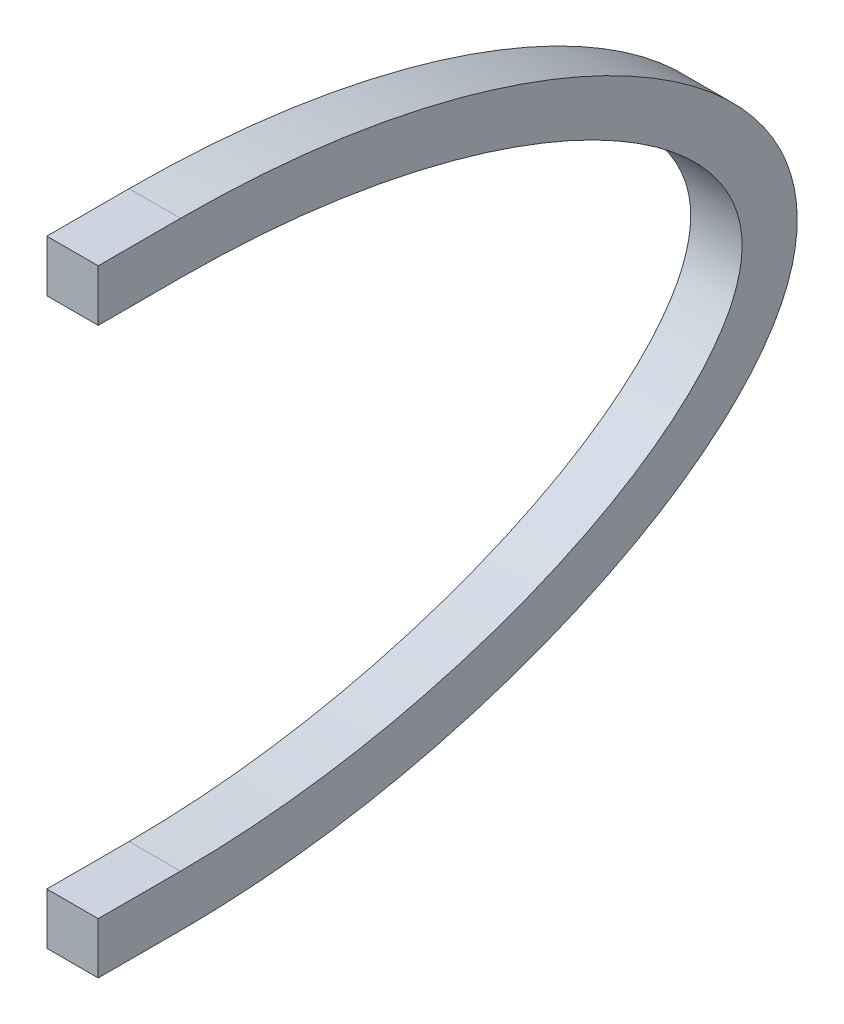
ISO-10303-21;
HEADER;
FILE_DESCRIPTION(('STEP AP214'),'2;1');
FILE_NAME('part.step','',(''),(''),'','','');
FILE_SCHEMA(('AUTOMOTIVE_DESIGN { 1 0 10303 214 1 1 1 1 }'));
ENDSEC;
DATA;
#1=APPLICATION_CONTEXT('core data for automotive mechanical design processes');
#2=APPLICATION_PROTOCOL_DEFINITION('international standard','automotive_design',2000,#1);
#3=PRODUCT_CONTEXT('',#1,'mechanical');
#4=PRODUCT('Part','Part','',(#3));
#5=PRODUCT_RELATED_PRODUCT_CATEGORY('part','',(#4));
#6=PRODUCT_DEFINITION_FORMATION('','',#4);
#7=PRODUCT_DEFINITION_CONTEXT('part definition',#1,'design');
#8=PRODUCT_DEFINITION('design','',#6,#7);
#9=PRODUCT_DEFINITION_SHAPE('','',#8);
#10=(LENGTH_UNIT() NAMED_UNIT(*) SI_UNIT(.MILLI.,.METRE.));
#11=(NAMED_UNIT(*) PLANE_ANGLE_UNIT() SI_UNIT($,.RADIAN.));
#12=(NAMED_UNIT(*) SI_UNIT($,.STERADIAN.) SOLID_ANGLE_UNIT());
#13=UNCERTAINTY_MEASURE_WITH_UNIT(LENGTH_MEASURE(1.E-05),#10,'distance_accuracy_value','');
#14=(GEOMETRIC_REPRESENTATION_CONTEXT(3) GLOBAL_UNCERTAINTY_ASSIGNED_CONTEXT((#13)) GLOBAL_UNIT_ASSIGNED_CONTEXT((#10,
#11,#12)) REPRESENTATION_CONTEXT('',''));
#15=CARTESIAN_POINT('',(0.,0.,0.));
#16=DIRECTION('',(0.,0.,1.));
#17=DIRECTION('',(1.,0.,0.));
#18=AXIS2_PLACEMENT_3D('',#15,#16,#17);
#19=CARTESIAN_POINT('',(2.5,0.,8.));
#20=DIRECTION('',(0.,0.,-1.));
#21=DIRECTION('',(-1.,0.,0.));
#22=AXIS2_PLACEMENT_3D('',#19,#20,#21);
#23=PLANE('',#22);
#24=DIRECTION('',(0.,-1.,0.));
#25=VECTOR('',#24,1.);
#26=CARTESIAN_POINT('',(-2.5,0.,8.));
#27=LINE('',#26,#25);
#28=CARTESIAN_POINT('',(-2.5,30.0098482001997,8.));
#29=VERTEX_POINT('',#28);
#30=CARTESIAN_POINT('',(-2.5,24.9900725281221,8.));
#31=VERTEX_POINT('',#30);
#32=EDGE_CURVE('E160',#29,#31,#27,.T.);
#33=ORIENTED_EDGE('',*,*,#32,.T.);
#34=DIRECTION('',(-1.,0.,0.));
#35=VECTOR('',#34,1.);
#36=CARTESIAN_POINT('',(2.5,24.9900725281221,8.));
#37=LINE('',#36,#35);
#38=CARTESIAN_POINT('',(2.5,24.9900725281221,8.));
#39=VERTEX_POINT('',#38);
#40=EDGE_CURVE('E12',#39,#31,#37,.T.);
#41=ORIENTED_EDGE('',*,*,#40,.F.);
#42=DIRECTION('',(0.,-1.,0.));
#43=VECTOR('',#42,1.);
#44=CARTESIAN_POINT('',(2.5,0.,8.));
#45=LINE('',#44,#43);
#46=CARTESIAN_POINT('',(2.5,30.0098482001997,8.));
#47=VERTEX_POINT('',#46);
#48=EDGE_CURVE('E198',#47,#39,#45,.T.);
#49=ORIENTED_EDGE('',*,*,#48,.F.);
#50=DIRECTION('',(-1.,0.,0.));
#51=VECTOR('',#50,1.);
#52=CARTESIAN_POINT('',(2.5,30.0098482001997,8.));
#53=LINE('',#52,#51);
#54=EDGE_CURVE('E191',#47,#29,#53,.T.);
#55=ORIENTED_EDGE('',*,*,#54,.T.);
#56=EDGE_LOOP('',(#33,#41,#49,#55));
#57=FACE_BOUND('',#56,.T.);
#58=ADVANCED_FACE('F81',(#57),#23,.F.);
#59=CARTESIAN_POINT('',(2.5,24.9900725281221,0.));
#60=DIRECTION('',(0.,1.,0.));
#61=DIRECTION('',(0.,0.,1.));
#62=AXIS2_PLACEMENT_3D('',#59,#60,#61);
#63=PLANE('',#62);
#64=DIRECTION('',(0.,0.,-1.));
#65=VECTOR('',#64,1.);
#66=CARTESIAN_POINT('',(-2.5,24.9900725281221,0.));
#67=LINE('',#66,#65);
#68=CARTESIAN_POINT('',(-2.5,24.9900725281221,0.));
#69=VERTEX_POINT('',#68);
#70=EDGE_CURVE('E212',#31,#69,#67,.T.);
#71=ORIENTED_EDGE('',*,*,#70,.T.);
#72=DIRECTION('',(-1.,0.,0.));
#73=VECTOR('',#72,1.);
#74=CARTESIAN_POINT('',(2.5,24.9900725281221,0.));
#75=LINE('',#74,#73);
#76=CARTESIAN_POINT('',(2.5,24.9900725281221,0.));
#77=VERTEX_POINT('',#76);
#78=EDGE_CURVE('E92',#77,#69,#75,.T.);
#79=ORIENTED_EDGE('',*,*,#78,.F.);
#80=DIRECTION('',(0.,0.,-1.));
#81=VECTOR('',#80,1.);
#82=CARTESIAN_POINT('',(2.5,24.9900725281221,0.));
#83=LINE('',#82,#81);
#84=EDGE_CURVE('E275',#39,#77,#83,.T.);
#85=ORIENTED_EDGE('',*,*,#84,.F.);
#86=ORIENTED_EDGE('',*,*,#40,.T.);
#87=EDGE_LOOP('',(#71,#79,#85,#86));
#88=FACE_BOUND('',#87,.T.);
#89=ADVANCED_FACE('F249',(#88),#63,.F.);
#90=CARTESIAN_POINT('',(2.5,24.9900725281221,0.));
#91=CARTESIAN_POINT('',(2.5,24.9900725281221,-30.1407293333589));
#92=CARTESIAN_POINT('',(2.5,0.,-80.2141149018919));
#93=CARTESIAN_POINT('',(2.5,-24.9900725281221,-27.9633761797929));
#94=CARTESIAN_POINT('',(2.5,-24.9900725281221,0.));
#95=B_SPLINE_CURVE_WITH_KNOTS('',3,(#90,#91,#92,#93,#94),.UNSPECIFIED.,.F.,.F.,(4,1,4),(0.,0.5,
1.),.UNSPECIFIED.);
#96=DIRECTION('',(-1.,0.,0.));
#97=VECTOR('',#96,1.);
#98=SURFACE_OF_LINEAR_EXTRUSION('',#95,#97);
#99=CARTESIAN_POINT('',(-2.5,24.9900725281221,0.));
#100=CARTESIAN_POINT('',(-2.5,24.9900725281221,-30.1407293333589));
#101=CARTESIAN_POINT('',(-2.5,0.,-80.2141149018919));
#102=CARTESIAN_POINT('',(-2.5,-24.9900725281221,-27.9633761797929));
#103=CARTESIAN_POINT('',(-2.5,-24.9900725281221,0.));
#104=B_SPLINE_CURVE_WITH_KNOTS('',3,(#99,#100,#101,#102,#103),.UNSPECIFIED.,.F.,.F.,(4,1,4),(0.,
0.5,1.),.UNSPECIFIED.);
#105=CARTESIAN_POINT('',(-2.5,-24.9900725281221,0.));
#106=VERTEX_POINT('',#105);
#107=EDGE_CURVE('E204',#69,#106,#104,.T.);
#108=ORIENTED_EDGE('',*,*,#107,.T.);
#109=DIRECTION('',(-1.,0.,0.));
#110=VECTOR('',#109,1.);
#111=CARTESIAN_POINT('',(2.5,-24.9900725281221,0.));
#112=LINE('',#111,#110);
#113=CARTESIAN_POINT('',(2.5,-24.9900725281221,0.));
#114=VERTEX_POINT('',#113);
#115=EDGE_CURVE('E150',#114,#106,#112,.T.);
#116=ORIENTED_EDGE('',*,*,#115,.F.);
#117=EDGE_CURVE('E230',#77,#114,#95,.T.);
#118=ORIENTED_EDGE('',*,*,#117,.F.);
#119=ORIENTED_EDGE('',*,*,#78,.T.);
#120=EDGE_LOOP('',(#108,#116,#118,#119));
#121=FACE_BOUND('',#120,.T.);
#122=ADVANCED_FACE('F244',(#121),#98,.F.);
#123=CARTESIAN_POINT('',(2.5,30.0098482001997,0.));
#124=CARTESIAN_POINT('',(2.5,30.0098482001997,-29.7778371410979));
#125=CARTESIAN_POINT('',(2.5,15.7248701121643,-59.9446987682967));
#126=CARTESIAN_POINT('',(2.5,-15.4539286630365,-60.5708278400925));
#127=CARTESIAN_POINT('',(2.5,-29.9901517998003,-27.8424121157058));
#128=CARTESIAN_POINT('',(2.5,-29.9901517998003,0.));
#129=B_SPLINE_CURVE_WITH_KNOTS('',3,(#123,#124,#125,#126,#127,#128),.UNSPECIFIED.,.F.,.F.,(4,1,
1,4),(0.,0.453231818913467,0.553231818913467,1.),.UNSPECIFIED.);
#130=DIRECTION('',(-1.,0.,0.));
#131=VECTOR('',#130,1.);
#132=SURFACE_OF_LINEAR_EXTRUSION('',#129,#131);
#133=CARTESIAN_POINT('',(-2.5,30.0098482001997,0.));
#134=CARTESIAN_POINT('',(-2.5,30.0098482001997,-29.7778371410979));
#135=CARTESIAN_POINT('',(-2.5,15.7248701121643,-59.9446987682967));
#136=CARTESIAN_POINT('',(-2.5,-15.4539286630365,-60.5708278400925));
#137=CARTESIAN_POINT('',(-2.5,-29.9901517998003,-27.8424121157058));
#138=CARTESIAN_POINT('',(-2.5,-29.9901517998003,0.));
#139=B_SPLINE_CURVE_WITH_KNOTS('',3,(#133,#134,#135,#136,#137,#138),.UNSPECIFIED.,.F.,.F.,(4,1,
1,4),(0.,0.453231818913467,0.553231818913467,1.),.UNSPECIFIED.);
#140=CARTESIAN_POINT('',(-2.5,30.0098482001997,0.));
#141=VERTEX_POINT('',#140);
#142=CARTESIAN_POINT('',(-2.5,-29.9901517998003,0.));
#143=VERTEX_POINT('',#142);
#144=EDGE_CURVE('E199',#141,#143,#139,.T.);
#145=ORIENTED_EDGE('',*,*,#144,.F.);
#146=DIRECTION('',(-1.,0.,0.));
#147=VECTOR('',#146,1.);
#148=CARTESIAN_POINT('',(2.5,30.0098482001997,0.));
#149=LINE('',#148,#147);
#150=CARTESIAN_POINT('',(2.5,30.0098482001997,0.));
#151=VERTEX_POINT('',#150);
#152=EDGE_CURVE('E188',#151,#141,#149,.T.);
#153=ORIENTED_EDGE('',*,*,#152,.F.);
#154=CARTESIAN_POINT('',(2.5,-29.9901517998003,0.));
#155=VERTEX_POINT('',#154);
#156=EDGE_CURVE('E223',#151,#155,#129,.T.);
#157=ORIENTED_EDGE('',*,*,#156,.T.);
#158=DIRECTION('',(-1.,0.,0.));
#159=VECTOR('',#158,1.);
#160=CARTESIAN_POINT('',(2.5,-29.9901517998003,0.));
#161=LINE('',#160,#159);
#162=EDGE_CURVE('E185',#155,#143,#161,.T.);
#163=ORIENTED_EDGE('',*,*,#162,.T.);
#164=EDGE_LOOP('',(#145,#153,#157,#163));
#165=FACE_BOUND('',#164,.T.);
#166=ADVANCED_FACE('F239',(#165),#132,.T.);
#167=CARTESIAN_POINT('',(2.5,30.0098482001997,0.));
#168=DIRECTION('',(0.,-1.,0.));
#169=DIRECTION('',(0.,0.,-1.));
#170=AXIS2_PLACEMENT_3D('',#167,#168,#169);
#171=PLANE('',#170);
#172=DIRECTION('',(0.,0.,1.));
#173=VECTOR('',#172,1.);
#174=CARTESIAN_POINT('',(-2.5,30.0098482001997,0.));
#175=LINE('',#174,#173);
#176=EDGE_CURVE('E195',#141,#29,#175,.T.);
#177=ORIENTED_EDGE('',*,*,#176,.T.);
#178=ORIENTED_EDGE('',*,*,#54,.F.);
#179=DIRECTION('',(0.,0.,1.));
#180=VECTOR('',#179,1.);
#181=CARTESIAN_POINT('',(2.5,30.0098482001997,0.));
#182=LINE('',#181,#180);
#183=EDGE_CURVE('E101',#151,#47,#182,.T.);
#184=ORIENTED_EDGE('',*,*,#183,.F.);
#185=ORIENTED_EDGE('',*,*,#152,.T.);
#186=EDGE_LOOP('',(#177,#178,#184,#185));
#187=FACE_BOUND('',#186,.T.);
#188=ADVANCED_FACE('F243',(#187),#171,.F.);
#189=CARTESIAN_POINT('',(2.5,0.,0.));
#190=DIRECTION('',(1.,0.,0.));
#191=DIRECTION('',(0.,0.,-1.));
#192=AXIS2_PLACEMENT_3D('',#189,#190,#191);
#193=PLANE('',#192);
#194=ORIENTED_EDGE('',*,*,#48,.T.);
#195=ORIENTED_EDGE('',*,*,#84,.T.);
#196=ORIENTED_EDGE('',*,*,#117,.T.);
#197=DIRECTION('',(0.,0.,1.));
#198=VECTOR('',#197,1.);
#199=CARTESIAN_POINT('',(2.5,-24.9900725281221,0.));
#200=LINE('',#199,#198);
#201=CARTESIAN_POINT('',(2.5,-24.9900725281221,8.));
#202=VERTEX_POINT('',#201);
#203=EDGE_CURVE('E172',#114,#202,#200,.T.);
#204=ORIENTED_EDGE('',*,*,#203,.T.);
#205=DIRECTION('',(0.,-1.,0.));
#206=VECTOR('',#205,1.);
#207=CARTESIAN_POINT('',(2.5,-24.9900725281221,8.));
#208=LINE('',#207,#206);
#209=CARTESIAN_POINT('',(2.5,-29.9901517998003,8.));
#210=VERTEX_POINT('',#209);
#211=EDGE_CURVE('E158',#202,#210,#208,.T.);
#212=ORIENTED_EDGE('',*,*,#211,.T.);
#213=DIRECTION('',(0.,0.,-1.));
#214=VECTOR('',#213,1.);
#215=CARTESIAN_POINT('',(2.5,-29.9901517998003,8.));
#216=LINE('',#215,#214);
#217=EDGE_CURVE('E155',#210,#155,#216,.T.);
#218=ORIENTED_EDGE('',*,*,#217,.T.);
#219=ORIENTED_EDGE('',*,*,#156,.F.);
#220=ORIENTED_EDGE('',*,*,#183,.T.);
#221=EDGE_LOOP('',(#194,#195,#196,#204,#212,#218,#219,#220));
#222=FACE_BOUND('',#221,.T.);
#223=ADVANCED_FACE('F270',(#222),#193,.T.);
#224=CARTESIAN_POINT('',(-2.5,0.,0.));
#225=DIRECTION('',(1.,0.,0.));
#226=DIRECTION('',(0.,0.,-1.));
#227=AXIS2_PLACEMENT_3D('',#224,#225,#226);
#228=PLANE('',#227);
#229=ORIENTED_EDGE('',*,*,#32,.F.);
#230=ORIENTED_EDGE('',*,*,#176,.F.);
#231=ORIENTED_EDGE('',*,*,#144,.T.);
#232=DIRECTION('',(0.,0.,-1.));
#233=VECTOR('',#232,1.);
#234=CARTESIAN_POINT('',(-2.5,-29.9901517998003,8.));
#235=LINE('',#234,#233);
#236=CARTESIAN_POINT('',(-2.5,-29.9901517998003,8.));
#237=VERTEX_POINT('',#236);
#238=EDGE_CURVE('E166',#237,#143,#235,.T.);
#239=ORIENTED_EDGE('',*,*,#238,.F.);
#240=DIRECTION('',(0.,-1.,0.));
#241=VECTOR('',#240,1.);
#242=CARTESIAN_POINT('',(-2.5,-24.9900725281221,8.));
#243=LINE('',#242,#241);
#244=CARTESIAN_POINT('',(-2.5,-24.9900725281221,8.));
#245=VERTEX_POINT('',#244);
#246=EDGE_CURVE('E138',#245,#237,#243,.T.);
#247=ORIENTED_EDGE('',*,*,#246,.F.);
#248=DIRECTION('',(0.,0.,1.));
#249=VECTOR('',#248,1.);
#250=CARTESIAN_POINT('',(-2.5,-24.9900725281221,0.));
#251=LINE('',#250,#249);
#252=EDGE_CURVE('E144',#106,#245,#251,.T.);
#253=ORIENTED_EDGE('',*,*,#252,.F.);
#254=ORIENTED_EDGE('',*,*,#107,.F.);
#255=ORIENTED_EDGE('',*,*,#70,.F.);
#256=EDGE_LOOP('',(#229,#230,#231,#239,#247,#253,#254,#255));
#257=FACE_BOUND('',#256,.T.);
#258=ADVANCED_FACE('F163',(#257),#228,.F.);
#259=CARTESIAN_POINT('',(2.5,-24.9900725281221,0.));
#260=DIRECTION('',(0.,-1.,0.));
#261=DIRECTION('',(0.,0.,-1.));
#262=AXIS2_PLACEMENT_3D('',#259,#260,#261);
#263=PLANE('',#262);
#264=ORIENTED_EDGE('',*,*,#252,.T.);
#265=DIRECTION('',(-1.,0.,0.));
#266=VECTOR('',#265,1.);
#267=CARTESIAN_POINT('',(2.5,-24.9900725281221,8.));
#268=LINE('',#267,#266);
#269=EDGE_CURVE('E147',#202,#245,#268,.T.);
#270=ORIENTED_EDGE('',*,*,#269,.F.);
#271=ORIENTED_EDGE('',*,*,#203,.F.);
#272=ORIENTED_EDGE('',*,*,#115,.T.);
#273=EDGE_LOOP('',(#264,#270,#271,#272));
#274=FACE_BOUND('',#273,.T.);
#275=ADVANCED_FACE('F145',(#274),#263,.F.);
#276=CARTESIAN_POINT('',(2.5,-24.9900725281221,8.));
#277=DIRECTION('',(0.,0.,-1.));
#278=DIRECTION('',(-1.,0.,0.));
#279=AXIS2_PLACEMENT_3D('',#276,#277,#278);
#280=PLANE('',#279);
#281=ORIENTED_EDGE('',*,*,#246,.T.);
#282=DIRECTION('',(-1.,0.,0.));
#283=VECTOR('',#282,1.);
#284=CARTESIAN_POINT('',(2.5,-29.9901517998003,8.));
#285=LINE('',#284,#283);
#286=EDGE_CURVE('E85',#210,#237,#285,.T.);
#287=ORIENTED_EDGE('',*,*,#286,.F.);
#288=ORIENTED_EDGE('',*,*,#211,.F.);
#289=ORIENTED_EDGE('',*,*,#269,.T.);
#290=EDGE_LOOP('',(#281,#287,#288,#289));
#291=FACE_BOUND('',#290,.T.);
#292=ADVANCED_FACE('F157',(#291),#280,.F.);
#293=CARTESIAN_POINT('',(2.5,-29.9901517998003,8.));
#294=DIRECTION('',(0.,1.,0.));
#295=DIRECTION('',(0.,0.,1.));
#296=AXIS2_PLACEMENT_3D('',#293,#294,#295);
#297=PLANE('',#296);
#298=ORIENTED_EDGE('',*,*,#238,.T.);
#299=ORIENTED_EDGE('',*,*,#162,.F.);
#300=ORIENTED_EDGE('',*,*,#217,.F.);
#301=ORIENTED_EDGE('',*,*,#286,.T.);
#302=EDGE_LOOP('',(#298,#299,#300,#301));
#303=FACE_BOUND('',#302,.T.);
#304=ADVANCED_FACE('F83',(#303),#297,.F.);
#305=CLOSED_SHELL('',(#58,#89,#122,#166,#188,#223,#258,#275,#292,#304));
#306=MANIFOLD_SOLID_BREP('B2',#305);
#307=ADVANCED_BREP_SHAPE_REPRESENTATION('',(#18,#306),#14);
#308=SHAPE_DEFINITION_REPRESENTATION(#9,#307);
ENDSEC;
END-ISO-10303-21;
